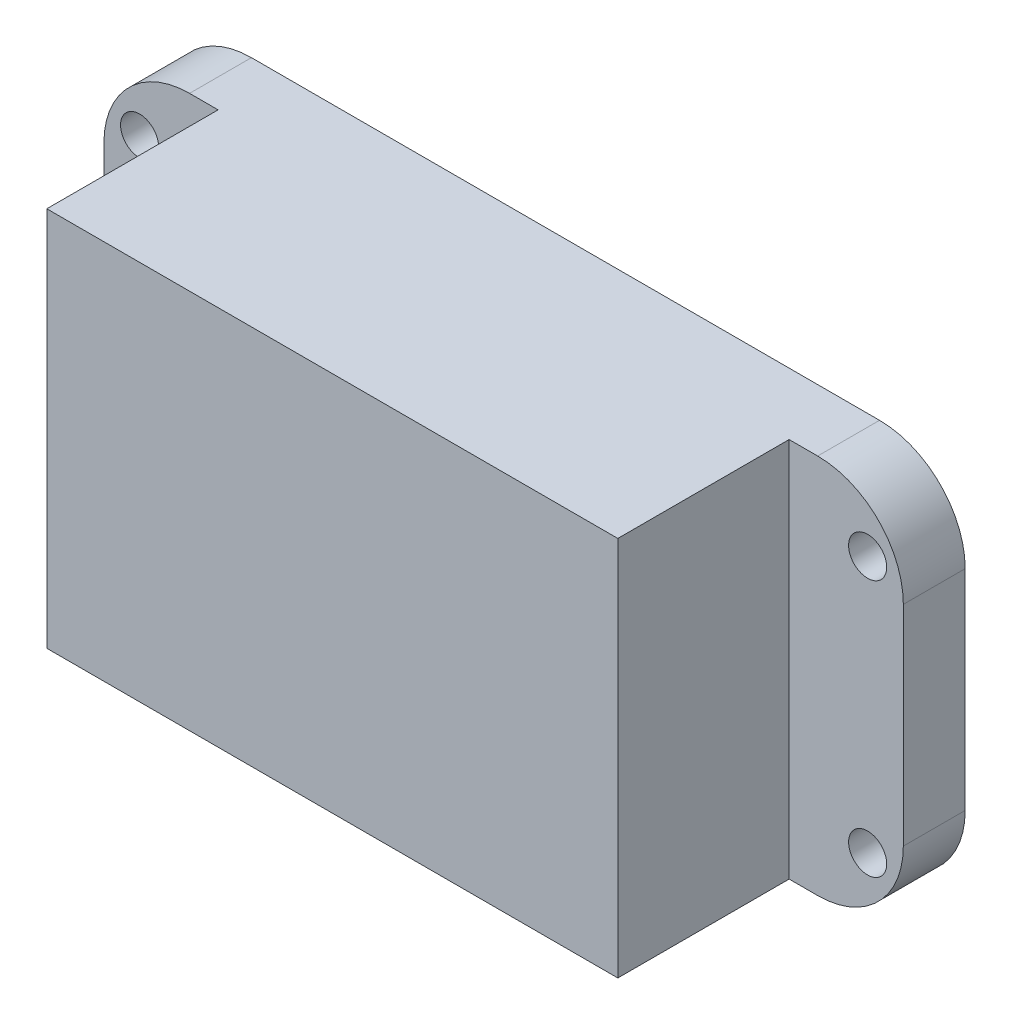
ISO-10303-21;
HEADER;
FILE_DESCRIPTION(('STEP AP214'),'2;1');
FILE_NAME('part.step','',(''),(''),'','','');
FILE_SCHEMA(('AUTOMOTIVE_DESIGN { 1 0 10303 214 1 1 1 1 }'));
ENDSEC;
DATA;
#1=APPLICATION_CONTEXT('core data for automotive mechanical design processes');
#2=APPLICATION_PROTOCOL_DEFINITION('international standard','automotive_design',2000,#1);
#3=PRODUCT_CONTEXT('',#1,'mechanical');
#4=PRODUCT('Part','Part','',(#3));
#5=PRODUCT_RELATED_PRODUCT_CATEGORY('part','',(#4));
#6=PRODUCT_DEFINITION_FORMATION('','',#4);
#7=PRODUCT_DEFINITION_CONTEXT('part definition',#1,'design');
#8=PRODUCT_DEFINITION('design','',#6,#7);
#9=PRODUCT_DEFINITION_SHAPE('','',#8);
#10=(LENGTH_UNIT() NAMED_UNIT(*) SI_UNIT(.MILLI.,.METRE.));
#11=(NAMED_UNIT(*) PLANE_ANGLE_UNIT() SI_UNIT($,.RADIAN.));
#12=(NAMED_UNIT(*) SI_UNIT($,.STERADIAN.) SOLID_ANGLE_UNIT());
#13=UNCERTAINTY_MEASURE_WITH_UNIT(LENGTH_MEASURE(1.E-05),#10,'distance_accuracy_value','');
#14=(GEOMETRIC_REPRESENTATION_CONTEXT(3) GLOBAL_UNCERTAINTY_ASSIGNED_CONTEXT((#13)) GLOBAL_UNIT_ASSIGNED_CONTEXT((#10,
#11,#12)) REPRESENTATION_CONTEXT('',''));
#15=CARTESIAN_POINT('',(0.,0.,0.));
#16=DIRECTION('',(0.,0.,1.));
#17=DIRECTION('',(1.,0.,0.));
#18=AXIS2_PLACEMENT_3D('',#15,#16,#17);
#19=CARTESIAN_POINT('',(33.,11.,6.5));
#20=DIRECTION('',(0.,0.,1.));
#21=DIRECTION('',(1.,0.,0.));
#22=AXIS2_PLACEMENT_3D('',#19,#20,#21);
#23=PLANE('',#22);
#24=DIRECTION('',(0.,-1.,0.));
#25=VECTOR('',#24,1.);
#26=CARTESIAN_POINT('',(-30.,20.,6.5));
#27=LINE('',#26,#25);
#28=CARTESIAN_POINT('',(-30.,20.,6.5));
#29=VERTEX_POINT('',#28);
#30=CARTESIAN_POINT('',(-30.,-20.,6.5));
#31=VERTEX_POINT('',#30);
#32=EDGE_CURVE('E142',#29,#31,#27,.T.);
#33=ORIENTED_EDGE('',*,*,#32,.F.);
#34=DIRECTION('',(-1.,0.,0.));
#35=VECTOR('',#34,1.);
#36=CARTESIAN_POINT('',(32.9999999999999,20.,6.5));
#37=LINE('',#36,#35);
#38=CARTESIAN_POINT('',(-32.9999999999999,20.,6.5));
#39=VERTEX_POINT('',#38);
#40=EDGE_CURVE('E176',#29,#39,#37,.T.);
#41=ORIENTED_EDGE('',*,*,#40,.T.);
#42=CARTESIAN_POINT('',(-33.,11.,6.5));
#43=DIRECTION('',(0.,0.,1.));
#44=DIRECTION('',(1.,0.,0.));
#45=AXIS2_PLACEMENT_3D('',#42,#43,#44);
#46=CIRCLE('',#45,9.);
#47=CARTESIAN_POINT('',(-42.,10.9999999999999,6.5));
#48=VERTEX_POINT('',#47);
#49=EDGE_CURVE('E180',#39,#48,#46,.T.);
#50=ORIENTED_EDGE('',*,*,#49,.T.);
#51=DIRECTION('',(0.,-1.,0.));
#52=VECTOR('',#51,1.);
#53=CARTESIAN_POINT('',(-42.,-10.9999999999999,6.5));
#54=LINE('',#53,#52);
#55=CARTESIAN_POINT('',(-42.,-11.,6.5));
#56=VERTEX_POINT('',#55);
#57=EDGE_CURVE('E182',#48,#56,#54,.T.);
#58=ORIENTED_EDGE('',*,*,#57,.T.);
#59=CARTESIAN_POINT('',(-33.,-11.,6.5));
#60=DIRECTION('',(0.,0.,1.));
#61=DIRECTION('',(-1.,0.,0.));
#62=AXIS2_PLACEMENT_3D('',#59,#60,#61);
#63=CIRCLE('',#62,9.);
#64=CARTESIAN_POINT('',(-32.9999999999999,-20.,6.5));
#65=VERTEX_POINT('',#64);
#66=EDGE_CURVE('E184',#56,#65,#63,.T.);
#67=ORIENTED_EDGE('',*,*,#66,.T.);
#68=DIRECTION('',(1.,0.,0.));
#69=VECTOR('',#68,1.);
#70=CARTESIAN_POINT('',(32.9999999999999,-20.,6.5));
#71=LINE('',#70,#69);
#72=EDGE_CURVE('E55',#65,#31,#71,.T.);
#73=ORIENTED_EDGE('',*,*,#72,.T.);
#74=EDGE_LOOP('',(#33,#41,#50,#58,#67,#73));
#75=FACE_BOUND('',#74,.T.);
#76=CARTESIAN_POINT('',(-38.25,-13.5,6.5));
#77=DIRECTION('',(0.,0.,1.));
#78=DIRECTION('',(-1.,0.,0.));
#79=AXIS2_PLACEMENT_3D('',#76,#77,#78);
#80=CIRCLE('',#79,2.);
#81=CARTESIAN_POINT('',(-40.25,-13.5,6.5));
#82=VERTEX_POINT('',#81);
#83=EDGE_CURVE('E146',#82,#82,#80,.T.);
#84=ORIENTED_EDGE('',*,*,#83,.F.);
#85=EDGE_LOOP('',(#84));
#86=FACE_BOUND('',#85,.T.);
#87=CARTESIAN_POINT('',(-38.25,13.5,6.5));
#88=DIRECTION('',(0.,0.,1.));
#89=DIRECTION('',(1.,0.,0.));
#90=AXIS2_PLACEMENT_3D('',#87,#88,#89);
#91=CIRCLE('',#90,2.);
#92=CARTESIAN_POINT('',(-40.25,13.5,6.5));
#93=VERTEX_POINT('',#92);
#94=EDGE_CURVE('E167',#93,#93,#91,.T.);
#95=ORIENTED_EDGE('',*,*,#94,.F.);
#96=EDGE_LOOP('',(#95));
#97=FACE_BOUND('',#96,.T.);
#98=ADVANCED_FACE('F32',(#75,#86,#97),#23,.T.);
#99=DIRECTION('',(0.,1.,0.));
#100=VECTOR('',#99,1.);
#101=CARTESIAN_POINT('',(30.,20.,6.5));
#102=LINE('',#101,#100);
#103=CARTESIAN_POINT('',(30.,-20.,6.5));
#104=VERTEX_POINT('',#103);
#105=CARTESIAN_POINT('',(30.,20.,6.5));
#106=VERTEX_POINT('',#105);
#107=EDGE_CURVE('E47',#104,#106,#102,.T.);
#108=ORIENTED_EDGE('',*,*,#107,.F.);
#109=CARTESIAN_POINT('',(32.9999999999999,-20.,6.5));
#110=VERTEX_POINT('',#109);
#111=EDGE_CURVE('E186',#104,#110,#71,.T.);
#112=ORIENTED_EDGE('',*,*,#111,.T.);
#113=CARTESIAN_POINT('',(33.,-11.,6.5));
#114=DIRECTION('',(0.,0.,1.));
#115=DIRECTION('',(1.,0.,0.));
#116=AXIS2_PLACEMENT_3D('',#113,#114,#115);
#117=CIRCLE('',#116,9.);
#118=CARTESIAN_POINT('',(42.,-10.9999999999999,6.5));
#119=VERTEX_POINT('',#118);
#120=EDGE_CURVE('E188',#110,#119,#117,.T.);
#121=ORIENTED_EDGE('',*,*,#120,.T.);
#122=DIRECTION('',(0.,1.,0.));
#123=VECTOR('',#122,1.);
#124=CARTESIAN_POINT('',(42.,-10.9999999999999,6.5));
#125=LINE('',#124,#123);
#126=CARTESIAN_POINT('',(42.,10.9999999999999,6.5));
#127=VERTEX_POINT('',#126);
#128=EDGE_CURVE('E190',#119,#127,#125,.T.);
#129=ORIENTED_EDGE('',*,*,#128,.T.);
#130=CARTESIAN_POINT('',(33.,11.,6.5));
#131=DIRECTION('',(0.,0.,1.));
#132=DIRECTION('',(1.,0.,0.));
#133=AXIS2_PLACEMENT_3D('',#130,#131,#132);
#134=CIRCLE('',#133,9.);
#135=CARTESIAN_POINT('',(32.9999999999999,20.,6.5));
#136=VERTEX_POINT('',#135);
#137=EDGE_CURVE('E173',#127,#136,#134,.T.);
#138=ORIENTED_EDGE('',*,*,#137,.T.);
#139=EDGE_CURVE('E178',#136,#106,#37,.T.);
#140=ORIENTED_EDGE('',*,*,#139,.T.);
#141=EDGE_LOOP('',(#108,#112,#121,#129,#138,#140));
#142=FACE_BOUND('',#141,.T.);
#143=CARTESIAN_POINT('',(38.25,-13.5,6.5));
#144=DIRECTION('',(0.,0.,1.));
#145=DIRECTION('',(1.,0.,0.));
#146=AXIS2_PLACEMENT_3D('',#143,#144,#145);
#147=CIRCLE('',#146,2.);
#148=CARTESIAN_POINT('',(36.25,-13.5,6.5));
#149=VERTEX_POINT('',#148);
#150=EDGE_CURVE('E155',#149,#149,#147,.T.);
#151=ORIENTED_EDGE('',*,*,#150,.F.);
#152=EDGE_LOOP('',(#151));
#153=FACE_BOUND('',#152,.T.);
#154=CARTESIAN_POINT('',(38.25,13.5,6.5));
#155=DIRECTION('',(0.,0.,1.));
#156=DIRECTION('',(-1.,0.,0.));
#157=AXIS2_PLACEMENT_3D('',#154,#155,#156);
#158=CIRCLE('',#157,2.);
#159=CARTESIAN_POINT('',(36.25,13.5,6.5));
#160=VERTEX_POINT('',#159);
#161=EDGE_CURVE('E161',#160,#160,#158,.T.);
#162=ORIENTED_EDGE('',*,*,#161,.F.);
#163=EDGE_LOOP('',(#162));
#164=FACE_BOUND('',#163,.T.);
#165=ADVANCED_FACE('F262',(#142,#153,#164),#23,.T.);
#166=CARTESIAN_POINT('',(33.,11.,0.));
#167=DIRECTION('',(0.,0.,1.));
#168=DIRECTION('',(1.,0.,0.));
#169=AXIS2_PLACEMENT_3D('',#166,#167,#168);
#170=PLANE('',#169);
#171=CARTESIAN_POINT('',(33.,11.,0.));
#172=DIRECTION('',(0.,0.,1.));
#173=DIRECTION('',(1.,0.,0.));
#174=AXIS2_PLACEMENT_3D('',#171,#172,#173);
#175=CIRCLE('',#174,9.);
#176=CARTESIAN_POINT('',(42.,10.9999999999999,0.));
#177=VERTEX_POINT('',#176);
#178=CARTESIAN_POINT('',(32.9999999999999,20.,0.));
#179=VERTEX_POINT('',#178);
#180=EDGE_CURVE('E170',#177,#179,#175,.T.);
#181=ORIENTED_EDGE('',*,*,#180,.F.);
#182=DIRECTION('',(0.,1.,0.));
#183=VECTOR('',#182,1.);
#184=CARTESIAN_POINT('',(42.,-10.9999999999999,0.));
#185=LINE('',#184,#183);
#186=CARTESIAN_POINT('',(42.,-10.9999999999999,0.));
#187=VERTEX_POINT('',#186);
#188=EDGE_CURVE('E177',#187,#177,#185,.T.);
#189=ORIENTED_EDGE('',*,*,#188,.F.);
#190=CARTESIAN_POINT('',(33.,-11.,0.));
#191=DIRECTION('',(0.,0.,1.));
#192=DIRECTION('',(1.,0.,0.));
#193=AXIS2_PLACEMENT_3D('',#190,#191,#192);
#194=CIRCLE('',#193,9.);
#195=CARTESIAN_POINT('',(32.9999999999999,-20.,0.));
#196=VERTEX_POINT('',#195);
#197=EDGE_CURVE('E205',#196,#187,#194,.T.);
#198=ORIENTED_EDGE('',*,*,#197,.F.);
#199=DIRECTION('',(1.,0.,0.));
#200=VECTOR('',#199,1.);
#201=CARTESIAN_POINT('',(32.9999999999999,-20.,0.));
#202=LINE('',#201,#200);
#203=CARTESIAN_POINT('',(-32.9999999999999,-20.,0.));
#204=VERTEX_POINT('',#203);
#205=EDGE_CURVE('E203',#204,#196,#202,.T.);
#206=ORIENTED_EDGE('',*,*,#205,.F.);
#207=CARTESIAN_POINT('',(-33.,-11.,0.));
#208=DIRECTION('',(0.,0.,1.));
#209=DIRECTION('',(-1.,0.,0.));
#210=AXIS2_PLACEMENT_3D('',#207,#208,#209);
#211=CIRCLE('',#210,9.);
#212=CARTESIAN_POINT('',(-42.,-11.,0.));
#213=VERTEX_POINT('',#212);
#214=EDGE_CURVE('E201',#213,#204,#211,.T.);
#215=ORIENTED_EDGE('',*,*,#214,.F.);
#216=DIRECTION('',(0.,-1.,0.));
#217=VECTOR('',#216,1.);
#218=CARTESIAN_POINT('',(-42.,-10.9999999999999,0.));
#219=LINE('',#218,#217);
#220=CARTESIAN_POINT('',(-42.,10.9999999999999,0.));
#221=VERTEX_POINT('',#220);
#222=EDGE_CURVE('E199',#221,#213,#219,.T.);
#223=ORIENTED_EDGE('',*,*,#222,.F.);
#224=CARTESIAN_POINT('',(-33.,11.,0.));
#225=DIRECTION('',(0.,0.,1.));
#226=DIRECTION('',(1.,0.,0.));
#227=AXIS2_PLACEMENT_3D('',#224,#225,#226);
#228=CIRCLE('',#227,9.);
#229=CARTESIAN_POINT('',(-32.9999999999999,20.,0.));
#230=VERTEX_POINT('',#229);
#231=EDGE_CURVE('E197',#230,#221,#228,.T.);
#232=ORIENTED_EDGE('',*,*,#231,.F.);
#233=DIRECTION('',(-1.,0.,0.));
#234=VECTOR('',#233,1.);
#235=CARTESIAN_POINT('',(32.9999999999999,20.,0.));
#236=LINE('',#235,#234);
#237=EDGE_CURVE('E195',#179,#230,#236,.T.);
#238=ORIENTED_EDGE('',*,*,#237,.F.);
#239=EDGE_LOOP('',(#181,#189,#198,#206,#215,#223,#232,#238));
#240=FACE_BOUND('',#239,.T.);
#241=CARTESIAN_POINT('',(-38.25,13.5,0.));
#242=DIRECTION('',(0.,0.,1.));
#243=DIRECTION('',(1.,0.,0.));
#244=AXIS2_PLACEMENT_3D('',#241,#242,#243);
#245=CIRCLE('',#244,2.);
#246=CARTESIAN_POINT('',(-40.25,13.5,0.));
#247=VERTEX_POINT('',#246);
#248=EDGE_CURVE('E164',#247,#247,#245,.T.);
#249=ORIENTED_EDGE('',*,*,#248,.T.);
#250=EDGE_LOOP('',(#249));
#251=FACE_BOUND('',#250,.T.);
#252=CARTESIAN_POINT('',(38.25,13.5,0.));
#253=DIRECTION('',(0.,0.,1.));
#254=DIRECTION('',(-1.,0.,0.));
#255=AXIS2_PLACEMENT_3D('',#252,#253,#254);
#256=CIRCLE('',#255,2.);
#257=CARTESIAN_POINT('',(36.25,13.5,0.));
#258=VERTEX_POINT('',#257);
#259=EDGE_CURVE('E158',#258,#258,#256,.T.);
#260=ORIENTED_EDGE('',*,*,#259,.T.);
#261=EDGE_LOOP('',(#260));
#262=FACE_BOUND('',#261,.T.);
#263=CARTESIAN_POINT('',(38.25,-13.5,0.));
#264=DIRECTION('',(0.,0.,1.));
#265=DIRECTION('',(1.,0.,0.));
#266=AXIS2_PLACEMENT_3D('',#263,#264,#265);
#267=CIRCLE('',#266,2.);
#268=CARTESIAN_POINT('',(36.25,-13.5,0.));
#269=VERTEX_POINT('',#268);
#270=EDGE_CURVE('E153',#269,#269,#267,.T.);
#271=ORIENTED_EDGE('',*,*,#270,.T.);
#272=EDGE_LOOP('',(#271));
#273=FACE_BOUND('',#272,.T.);
#274=CARTESIAN_POINT('',(-38.25,-13.5,0.));
#275=DIRECTION('',(0.,0.,1.));
#276=DIRECTION('',(-1.,0.,0.));
#277=AXIS2_PLACEMENT_3D('',#274,#275,#276);
#278=CIRCLE('',#277,2.);
#279=CARTESIAN_POINT('',(-40.25,-13.5,0.));
#280=VERTEX_POINT('',#279);
#281=EDGE_CURVE('E143',#280,#280,#278,.T.);
#282=ORIENTED_EDGE('',*,*,#281,.T.);
#283=EDGE_LOOP('',(#282));
#284=FACE_BOUND('',#283,.T.);
#285=ADVANCED_FACE('F236',(#240,#251,#262,#273,#284),#170,.F.);
#286=CARTESIAN_POINT('',(33.,11.,6.5));
#287=DIRECTION('',(0.,0.,-1.));
#288=DIRECTION('',(-1.,0.,0.));
#289=AXIS2_PLACEMENT_3D('',#286,#287,#288);
#290=CYLINDRICAL_SURFACE('',#289,9.);
#291=ORIENTED_EDGE('',*,*,#180,.T.);
#292=DIRECTION('',(0.,0.,-1.));
#293=VECTOR('',#292,1.);
#294=CARTESIAN_POINT('',(32.9999999999999,20.,6.5));
#295=LINE('',#294,#293);
#296=EDGE_CURVE('E11',#136,#179,#295,.T.);
#297=ORIENTED_EDGE('',*,*,#296,.F.);
#298=ORIENTED_EDGE('',*,*,#137,.F.);
#299=DIRECTION('',(0.,0.,-1.));
#300=VECTOR('',#299,1.);
#301=CARTESIAN_POINT('',(42.,10.9999999999999,6.5));
#302=LINE('',#301,#300);
#303=EDGE_CURVE('E192',#127,#177,#302,.T.);
#304=ORIENTED_EDGE('',*,*,#303,.T.);
#305=EDGE_LOOP('',(#291,#297,#298,#304));
#306=FACE_BOUND('',#305,.T.);
#307=ADVANCED_FACE('F34',(#306),#290,.T.);
#308=CARTESIAN_POINT('',(32.9999999999999,20.,6.5));
#309=DIRECTION('',(0.,-1.,0.));
#310=DIRECTION('',(1.,0.,0.));
#311=AXIS2_PLACEMENT_3D('',#308,#309,#310);
#312=PLANE('',#311);
#313=ORIENTED_EDGE('',*,*,#237,.T.);
#314=DIRECTION('',(0.,0.,-1.));
#315=VECTOR('',#314,1.);
#316=CARTESIAN_POINT('',(-32.9999999999999,20.,6.5));
#317=LINE('',#316,#315);
#318=EDGE_CURVE('E40',#39,#230,#317,.T.);
#319=ORIENTED_EDGE('',*,*,#318,.F.);
#320=ORIENTED_EDGE('',*,*,#40,.F.);
#321=DIRECTION('',(0.,0.,-1.));
#322=VECTOR('',#321,1.);
#323=CARTESIAN_POINT('',(-30.,20.,24.5));
#324=LINE('',#323,#322);
#325=CARTESIAN_POINT('',(-30.,20.,24.5));
#326=VERTEX_POINT('',#325);
#327=EDGE_CURVE('E250',#326,#29,#324,.T.);
#328=ORIENTED_EDGE('',*,*,#327,.F.);
#329=DIRECTION('',(-1.,0.,0.));
#330=VECTOR('',#329,1.);
#331=CARTESIAN_POINT('',(30.,20.,24.5));
#332=LINE('',#331,#330);
#333=CARTESIAN_POINT('',(30.,20.,24.5));
#334=VERTEX_POINT('',#333);
#335=EDGE_CURVE('E136',#334,#326,#332,.T.);
#336=ORIENTED_EDGE('',*,*,#335,.F.);
#337=DIRECTION('',(0.,0.,-1.));
#338=VECTOR('',#337,1.);
#339=CARTESIAN_POINT('',(30.,20.,24.5));
#340=LINE('',#339,#338);
#341=EDGE_CURVE('E148',#334,#106,#340,.T.);
#342=ORIENTED_EDGE('',*,*,#341,.T.);
#343=ORIENTED_EDGE('',*,*,#139,.F.);
#344=ORIENTED_EDGE('',*,*,#296,.T.);
#345=EDGE_LOOP('',(#313,#319,#320,#328,#336,#342,#343,#344));
#346=FACE_BOUND('',#345,.T.);
#347=ADVANCED_FACE('F249',(#346),#312,.F.);
#348=CARTESIAN_POINT('',(-33.,11.,6.5));
#349=DIRECTION('',(0.,0.,-1.));
#350=DIRECTION('',(-1.,0.,0.));
#351=AXIS2_PLACEMENT_3D('',#348,#349,#350);
#352=CYLINDRICAL_SURFACE('',#351,9.);
#353=ORIENTED_EDGE('',*,*,#231,.T.);
#354=DIRECTION('',(0.,0.,-1.));
#355=VECTOR('',#354,1.);
#356=CARTESIAN_POINT('',(-42.,10.9999999999999,6.5));
#357=LINE('',#356,#355);
#358=EDGE_CURVE('E222',#48,#221,#357,.T.);
#359=ORIENTED_EDGE('',*,*,#358,.F.);
#360=ORIENTED_EDGE('',*,*,#49,.F.);
#361=ORIENTED_EDGE('',*,*,#318,.T.);
#362=EDGE_LOOP('',(#353,#359,#360,#361));
#363=FACE_BOUND('',#362,.T.);
#364=ADVANCED_FACE('F229',(#363),#352,.T.);
#365=CARTESIAN_POINT('',(-42.,-10.9999999999999,6.5));
#366=DIRECTION('',(1.,0.,0.));
#367=DIRECTION('',(0.,0.,-1.));
#368=AXIS2_PLACEMENT_3D('',#365,#366,#367);
#369=PLANE('',#368);
#370=ORIENTED_EDGE('',*,*,#222,.T.);
#371=DIRECTION('',(0.,0.,-1.));
#372=VECTOR('',#371,1.);
#373=CARTESIAN_POINT('',(-42.,-11.,6.5));
#374=LINE('',#373,#372);
#375=EDGE_CURVE('E219',#56,#213,#374,.T.);
#376=ORIENTED_EDGE('',*,*,#375,.F.);
#377=ORIENTED_EDGE('',*,*,#57,.F.);
#378=ORIENTED_EDGE('',*,*,#358,.T.);
#379=EDGE_LOOP('',(#370,#376,#377,#378));
#380=FACE_BOUND('',#379,.T.);
#381=ADVANCED_FACE('F242',(#380),#369,.F.);
#382=CARTESIAN_POINT('',(-33.,-11.,6.5));
#383=DIRECTION('',(0.,0.,-1.));
#384=DIRECTION('',(-1.,0.,0.));
#385=AXIS2_PLACEMENT_3D('',#382,#383,#384);
#386=CYLINDRICAL_SURFACE('',#385,9.);
#387=ORIENTED_EDGE('',*,*,#214,.T.);
#388=DIRECTION('',(0.,0.,-1.));
#389=VECTOR('',#388,1.);
#390=CARTESIAN_POINT('',(-32.9999999999999,-20.,6.5));
#391=LINE('',#390,#389);
#392=EDGE_CURVE('E216',#65,#204,#391,.T.);
#393=ORIENTED_EDGE('',*,*,#392,.F.);
#394=ORIENTED_EDGE('',*,*,#66,.F.);
#395=ORIENTED_EDGE('',*,*,#375,.T.);
#396=EDGE_LOOP('',(#387,#393,#394,#395));
#397=FACE_BOUND('',#396,.T.);
#398=ADVANCED_FACE('F246',(#397),#386,.T.);
#399=CARTESIAN_POINT('',(32.9999999999999,-20.,6.5));
#400=DIRECTION('',(0.,1.,0.));
#401=DIRECTION('',(-1.,0.,0.));
#402=AXIS2_PLACEMENT_3D('',#399,#400,#401);
#403=PLANE('',#402);
#404=ORIENTED_EDGE('',*,*,#205,.T.);
#405=DIRECTION('',(0.,0.,-1.));
#406=VECTOR('',#405,1.);
#407=CARTESIAN_POINT('',(32.9999999999999,-20.,6.5));
#408=LINE('',#407,#406);
#409=EDGE_CURVE('E213',#110,#196,#408,.T.);
#410=ORIENTED_EDGE('',*,*,#409,.F.);
#411=ORIENTED_EDGE('',*,*,#111,.F.);
#412=DIRECTION('',(0.,0.,-1.));
#413=VECTOR('',#412,1.);
#414=CARTESIAN_POINT('',(30.,-20.,24.5));
#415=LINE('',#414,#413);
#416=CARTESIAN_POINT('',(30.,-20.,24.5));
#417=VERTEX_POINT('',#416);
#418=EDGE_CURVE('E127',#417,#104,#415,.T.);
#419=ORIENTED_EDGE('',*,*,#418,.F.);
#420=DIRECTION('',(1.,0.,0.));
#421=VECTOR('',#420,1.);
#422=CARTESIAN_POINT('',(30.,-20.,24.5));
#423=LINE('',#422,#421);
#424=CARTESIAN_POINT('',(-30.,-20.,24.5));
#425=VERTEX_POINT('',#424);
#426=EDGE_CURVE('E120',#425,#417,#423,.T.);
#427=ORIENTED_EDGE('',*,*,#426,.F.);
#428=DIRECTION('',(0.,0.,-1.));
#429=VECTOR('',#428,1.);
#430=CARTESIAN_POINT('',(-30.,-20.,24.5));
#431=LINE('',#430,#429);
#432=EDGE_CURVE('E124',#425,#31,#431,.T.);
#433=ORIENTED_EDGE('',*,*,#432,.T.);
#434=ORIENTED_EDGE('',*,*,#72,.F.);
#435=ORIENTED_EDGE('',*,*,#392,.T.);
#436=EDGE_LOOP('',(#404,#410,#411,#419,#427,#433,#434,#435));
#437=FACE_BOUND('',#436,.T.);
#438=ADVANCED_FACE('F122',(#437),#403,.F.);
#439=CARTESIAN_POINT('',(33.,-11.,6.5));
#440=DIRECTION('',(0.,0.,-1.));
#441=DIRECTION('',(-1.,0.,0.));
#442=AXIS2_PLACEMENT_3D('',#439,#440,#441);
#443=CYLINDRICAL_SURFACE('',#442,9.);
#444=ORIENTED_EDGE('',*,*,#197,.T.);
#445=DIRECTION('',(0.,0.,-1.));
#446=VECTOR('',#445,1.);
#447=CARTESIAN_POINT('',(42.,-10.9999999999999,6.5));
#448=LINE('',#447,#446);
#449=EDGE_CURVE('E210',#119,#187,#448,.T.);
#450=ORIENTED_EDGE('',*,*,#449,.F.);
#451=ORIENTED_EDGE('',*,*,#120,.F.);
#452=ORIENTED_EDGE('',*,*,#409,.T.);
#453=EDGE_LOOP('',(#444,#450,#451,#452));
#454=FACE_BOUND('',#453,.T.);
#455=ADVANCED_FACE('F274',(#454),#443,.T.);
#456=CARTESIAN_POINT('',(42.,-10.9999999999999,6.5));
#457=DIRECTION('',(-1.,0.,0.));
#458=DIRECTION('',(0.,0.,1.));
#459=AXIS2_PLACEMENT_3D('',#456,#457,#458);
#460=PLANE('',#459);
#461=ORIENTED_EDGE('',*,*,#188,.T.);
#462=ORIENTED_EDGE('',*,*,#303,.F.);
#463=ORIENTED_EDGE('',*,*,#128,.F.);
#464=ORIENTED_EDGE('',*,*,#449,.T.);
#465=EDGE_LOOP('',(#461,#462,#463,#464));
#466=FACE_BOUND('',#465,.T.);
#467=ADVANCED_FACE('F270',(#466),#460,.F.);
#468=CARTESIAN_POINT('',(-38.25,13.5,6.5));
#469=DIRECTION('',(0.,0.,-1.));
#470=DIRECTION('',(-1.,0.,0.));
#471=AXIS2_PLACEMENT_3D('',#468,#469,#470);
#472=CYLINDRICAL_SURFACE('',#471,2.);
#473=CARTESIAN_POINT('',(-40.25,13.5,6.5));
#474=CARTESIAN_POINT('',(-40.25,13.5,6.43229166666667));
#475=CARTESIAN_POINT('',(-40.25,13.5,6.36458333333333));
#476=CARTESIAN_POINT('',(-40.25,13.5,6.22916666666667));
#477=CARTESIAN_POINT('',(-40.25,13.5,6.16145833333333));
#478=CARTESIAN_POINT('',(-40.25,13.5,6.02604166666667));
#479=CARTESIAN_POINT('',(-40.25,13.5,5.95833333333333));
#480=CARTESIAN_POINT('',(-40.25,13.5,5.82291666666667));
#481=CARTESIAN_POINT('',(-40.25,13.5,5.75520833333333));
#482=CARTESIAN_POINT('',(-40.25,13.5,5.61979166666667));
#483=CARTESIAN_POINT('',(-40.25,13.5,5.55208333333333));
#484=CARTESIAN_POINT('',(-40.25,13.5,5.41666666666667));
#485=CARTESIAN_POINT('',(-40.25,13.5,5.34895833333333));
#486=CARTESIAN_POINT('',(-40.25,13.5,5.21354166666667));
#487=CARTESIAN_POINT('',(-40.25,13.5,5.14583333333333));
#488=CARTESIAN_POINT('',(-40.25,13.5,5.01041666666667));
#489=CARTESIAN_POINT('',(-40.25,13.5,4.94270833333333));
#490=CARTESIAN_POINT('',(-40.25,13.5,4.80729166666667));
#491=CARTESIAN_POINT('',(-40.25,13.5,4.73958333333333));
#492=CARTESIAN_POINT('',(-40.25,13.5,4.60416666666667));
#493=CARTESIAN_POINT('',(-40.25,13.5,4.53645833333333));
#494=CARTESIAN_POINT('',(-40.25,13.5,4.40104166666667));
#495=CARTESIAN_POINT('',(-40.25,13.5,4.33333333333333));
#496=CARTESIAN_POINT('',(-40.25,13.5,4.19791666666667));
#497=CARTESIAN_POINT('',(-40.25,13.5,4.13020833333333));
#498=CARTESIAN_POINT('',(-40.25,13.5,3.99479166666667));
#499=CARTESIAN_POINT('',(-40.25,13.5,3.92708333333333));
#500=CARTESIAN_POINT('',(-40.25,13.5,3.79166666666667));
#501=CARTESIAN_POINT('',(-40.25,13.5,3.72395833333333));
#502=CARTESIAN_POINT('',(-40.25,13.5,3.58854166666667));
#503=CARTESIAN_POINT('',(-40.25,13.5,3.52083333333333));
#504=CARTESIAN_POINT('',(-40.25,13.5,3.38541666666667));
#505=CARTESIAN_POINT('',(-40.25,13.5,3.31770833333333));
#506=CARTESIAN_POINT('',(-40.25,13.5,3.18229166666667));
#507=CARTESIAN_POINT('',(-40.25,13.5,3.11458333333333));
#508=CARTESIAN_POINT('',(-40.25,13.5,2.97916666666667));
#509=CARTESIAN_POINT('',(-40.25,13.5,2.91145833333333));
#510=CARTESIAN_POINT('',(-40.25,13.5,2.77604166666667));
#511=CARTESIAN_POINT('',(-40.25,13.5,2.70833333333333));
#512=CARTESIAN_POINT('',(-40.25,13.5,2.57291666666667));
#513=CARTESIAN_POINT('',(-40.25,13.5,2.50520833333333));
#514=CARTESIAN_POINT('',(-40.25,13.5,2.36979166666667));
#515=CARTESIAN_POINT('',(-40.25,13.5,2.30208333333333));
#516=CARTESIAN_POINT('',(-40.25,13.5,2.16666666666667));
#517=CARTESIAN_POINT('',(-40.25,13.5,2.09895833333333));
#518=CARTESIAN_POINT('',(-40.25,13.5,1.96354166666667));
#519=CARTESIAN_POINT('',(-40.25,13.5,1.89583333333333));
#520=CARTESIAN_POINT('',(-40.25,13.5,1.76041666666667));
#521=CARTESIAN_POINT('',(-40.25,13.5,1.69270833333333));
#522=CARTESIAN_POINT('',(-40.25,13.5,1.55729166666667));
#523=CARTESIAN_POINT('',(-40.25,13.5,1.48958333333333));
#524=CARTESIAN_POINT('',(-40.25,13.5,1.35416666666667));
#525=CARTESIAN_POINT('',(-40.25,13.5,1.28645833333333));
#526=CARTESIAN_POINT('',(-40.25,13.5,1.15104166666667));
#527=CARTESIAN_POINT('',(-40.25,13.5,1.08333333333333));
#528=CARTESIAN_POINT('',(-40.25,13.5,0.947916666666667));
#529=CARTESIAN_POINT('',(-40.25,13.5,0.880208333333333));
#530=CARTESIAN_POINT('',(-40.25,13.5,0.744791666666667));
#531=CARTESIAN_POINT('',(-40.25,13.5,0.677083333333333));
#532=CARTESIAN_POINT('',(-40.25,13.5,0.541666666666667));
#533=CARTESIAN_POINT('',(-40.25,13.5,0.473958333333333));
#534=CARTESIAN_POINT('',(-40.25,13.5,0.338541666666667));
#535=CARTESIAN_POINT('',(-40.25,13.5,0.270833333333334));
#536=CARTESIAN_POINT('',(-40.25,13.5,0.135416666666667));
#537=CARTESIAN_POINT('',(-40.25,13.5,0.0677083333333334));
#538=CARTESIAN_POINT('',(-40.25,13.5,0.));
#539=B_SPLINE_CURVE_WITH_KNOTS('',3,(#473,#474,#475,#476,#477,#478,#479,#480,#481,#482,#483,
#484,#485,#486,#487,#488,#489,#490,#491,#492,#493,#494,#495,#496,#497,#498,#499,#500,#501,#502,
#503,#504,#505,#506,#507,#508,#509,#510,#511,#512,#513,#514,#515,#516,#517,#518,#519,#520,#521,
#522,#523,#524,#525,#526,#527,#528,#529,#530,#531,#532,#533,#534,#535,#536,#537,#538),
.UNSPECIFIED.,.F.,.F.,(4,2,2,2,2,2,2,2,2,2,2,2,2,2,2,2,2,2,2,2,2,2,2,2,2,2,2,2,2,2,2,2,4),(0.,
0.203124999999999,0.40625,0.609375,0.812499999999999,1.015625,1.21875,1.421875,1.625,1.828125,
2.03125,2.234375,2.4375,2.640625,2.84375,3.046875,3.25,3.453125,3.65625,3.859375,4.0625,
4.265625,4.46875,4.671875,4.875,5.078125,5.28125,5.484375,5.6875,5.890625,6.09375,6.296875,6.5),.UNSPECIFIED.);
#540=EDGE_CURVE('BSEAM282',#93,#247,#539,.T.);
#541=ORIENTED_EDGE('',*,*,#94,.T.);
#542=ORIENTED_EDGE('',*,*,#248,.F.);
#543=ORIENTED_EDGE('',*,*,#540,.T.);
#544=ORIENTED_EDGE('',*,*,#540,.F.);
#545=EDGE_LOOP('',(#541,#543,#542,#544));
#546=FACE_BOUND('',#545,.T.);
#547=ADVANCED_FACE('F282',(#546),#472,.F.);
#548=CARTESIAN_POINT('',(38.25,13.5,6.5));
#549=DIRECTION('',(0.,0.,-1.));
#550=DIRECTION('',(-1.,0.,0.));
#551=AXIS2_PLACEMENT_3D('',#548,#549,#550);
#552=CYLINDRICAL_SURFACE('',#551,2.);
#553=CARTESIAN_POINT('',(36.25,13.5,6.5));
#554=CARTESIAN_POINT('',(36.25,13.5,6.43229166666667));
#555=CARTESIAN_POINT('',(36.25,13.5,6.36458333333333));
#556=CARTESIAN_POINT('',(36.25,13.5,6.22916666666667));
#557=CARTESIAN_POINT('',(36.25,13.5,6.16145833333333));
#558=CARTESIAN_POINT('',(36.25,13.5,6.02604166666667));
#559=CARTESIAN_POINT('',(36.25,13.5,5.95833333333333));
#560=CARTESIAN_POINT('',(36.25,13.5,5.82291666666667));
#561=CARTESIAN_POINT('',(36.25,13.5,5.75520833333333));
#562=CARTESIAN_POINT('',(36.25,13.5,5.61979166666667));
#563=CARTESIAN_POINT('',(36.25,13.5,5.55208333333333));
#564=CARTESIAN_POINT('',(36.25,13.5,5.41666666666667));
#565=CARTESIAN_POINT('',(36.25,13.5,5.34895833333333));
#566=CARTESIAN_POINT('',(36.25,13.5,5.21354166666667));
#567=CARTESIAN_POINT('',(36.25,13.5,5.14583333333333));
#568=CARTESIAN_POINT('',(36.25,13.5,5.01041666666667));
#569=CARTESIAN_POINT('',(36.25,13.5,4.94270833333333));
#570=CARTESIAN_POINT('',(36.25,13.5,4.80729166666667));
#571=CARTESIAN_POINT('',(36.25,13.5,4.73958333333333));
#572=CARTESIAN_POINT('',(36.25,13.5,4.60416666666667));
#573=CARTESIAN_POINT('',(36.25,13.5,4.53645833333333));
#574=CARTESIAN_POINT('',(36.25,13.5,4.40104166666667));
#575=CARTESIAN_POINT('',(36.25,13.5,4.33333333333333));
#576=CARTESIAN_POINT('',(36.25,13.5,4.19791666666667));
#577=CARTESIAN_POINT('',(36.25,13.5,4.13020833333333));
#578=CARTESIAN_POINT('',(36.25,13.5,3.99479166666667));
#579=CARTESIAN_POINT('',(36.25,13.5,3.92708333333333));
#580=CARTESIAN_POINT('',(36.25,13.5,3.79166666666667));
#581=CARTESIAN_POINT('',(36.25,13.5,3.72395833333333));
#582=CARTESIAN_POINT('',(36.25,13.5,3.58854166666667));
#583=CARTESIAN_POINT('',(36.25,13.5,3.52083333333333));
#584=CARTESIAN_POINT('',(36.25,13.5,3.38541666666667));
#585=CARTESIAN_POINT('',(36.25,13.5,3.31770833333333));
#586=CARTESIAN_POINT('',(36.25,13.5,3.18229166666667));
#587=CARTESIAN_POINT('',(36.25,13.5,3.11458333333333));
#588=CARTESIAN_POINT('',(36.25,13.5,2.97916666666667));
#589=CARTESIAN_POINT('',(36.25,13.5,2.91145833333333));
#590=CARTESIAN_POINT('',(36.25,13.5,2.77604166666667));
#591=CARTESIAN_POINT('',(36.25,13.5,2.70833333333333));
#592=CARTESIAN_POINT('',(36.25,13.5,2.57291666666667));
#593=CARTESIAN_POINT('',(36.25,13.5,2.50520833333333));
#594=CARTESIAN_POINT('',(36.25,13.5,2.36979166666667));
#595=CARTESIAN_POINT('',(36.25,13.5,2.30208333333333));
#596=CARTESIAN_POINT('',(36.25,13.5,2.16666666666667));
#597=CARTESIAN_POINT('',(36.25,13.5,2.09895833333333));
#598=CARTESIAN_POINT('',(36.25,13.5,1.96354166666667));
#599=CARTESIAN_POINT('',(36.25,13.5,1.89583333333333));
#600=CARTESIAN_POINT('',(36.25,13.5,1.76041666666667));
#601=CARTESIAN_POINT('',(36.25,13.5,1.69270833333333));
#602=CARTESIAN_POINT('',(36.25,13.5,1.55729166666667));
#603=CARTESIAN_POINT('',(36.25,13.5,1.48958333333333));
#604=CARTESIAN_POINT('',(36.25,13.5,1.35416666666667));
#605=CARTESIAN_POINT('',(36.25,13.5,1.28645833333333));
#606=CARTESIAN_POINT('',(36.25,13.5,1.15104166666667));
#607=CARTESIAN_POINT('',(36.25,13.5,1.08333333333333));
#608=CARTESIAN_POINT('',(36.25,13.5,0.947916666666667));
#609=CARTESIAN_POINT('',(36.25,13.5,0.880208333333333));
#610=CARTESIAN_POINT('',(36.25,13.5,0.744791666666667));
#611=CARTESIAN_POINT('',(36.25,13.5,0.677083333333333));
#612=CARTESIAN_POINT('',(36.25,13.5,0.541666666666667));
#613=CARTESIAN_POINT('',(36.25,13.5,0.473958333333333));
#614=CARTESIAN_POINT('',(36.25,13.5,0.338541666666667));
#615=CARTESIAN_POINT('',(36.25,13.5,0.270833333333334));
#616=CARTESIAN_POINT('',(36.25,13.5,0.135416666666667));
#617=CARTESIAN_POINT('',(36.25,13.5,0.0677083333333334));
#618=CARTESIAN_POINT('',(36.25,13.5,0.));
#619=B_SPLINE_CURVE_WITH_KNOTS('',3,(#553,#554,#555,#556,#557,#558,#559,#560,#561,#562,#563,
#564,#565,#566,#567,#568,#569,#570,#571,#572,#573,#574,#575,#576,#577,#578,#579,#580,#581,#582,
#583,#584,#585,#586,#587,#588,#589,#590,#591,#592,#593,#594,#595,#596,#597,#598,#599,#600,#601,
#602,#603,#604,#605,#606,#607,#608,#609,#610,#611,#612,#613,#614,#615,#616,#617,#618),
.UNSPECIFIED.,.F.,.F.,(4,2,2,2,2,2,2,2,2,2,2,2,2,2,2,2,2,2,2,2,2,2,2,2,2,2,2,2,2,2,2,2,4),(0.,
0.203124999999999,0.40625,0.609375,0.812499999999999,1.015625,1.21875,1.421875,1.625,1.828125,
2.03125,2.234375,2.4375,2.640625,2.84375,3.046875,3.25,3.453125,3.65625,3.859375,4.0625,
4.265625,4.46875,4.671875,4.875,5.078125,5.28125,5.484375,5.6875,5.890625,6.09375,6.296875,6.5),.UNSPECIFIED.);
#620=EDGE_CURVE('BSEAM355',#160,#258,#619,.T.);
#621=ORIENTED_EDGE('',*,*,#161,.T.);
#622=ORIENTED_EDGE('',*,*,#259,.F.);
#623=ORIENTED_EDGE('',*,*,#620,.T.);
#624=ORIENTED_EDGE('',*,*,#620,.F.);
#625=EDGE_LOOP('',(#621,#623,#622,#624));
#626=FACE_BOUND('',#625,.T.);
#627=ADVANCED_FACE('F355',(#626),#552,.F.);
#628=CARTESIAN_POINT('',(38.25,-13.5,6.5));
#629=DIRECTION('',(0.,0.,-1.));
#630=DIRECTION('',(-1.,0.,0.));
#631=AXIS2_PLACEMENT_3D('',#628,#629,#630);
#632=CYLINDRICAL_SURFACE('',#631,2.);
#633=CARTESIAN_POINT('',(36.25,-13.5,6.5));
#634=CARTESIAN_POINT('',(36.25,-13.5,6.43229166666667));
#635=CARTESIAN_POINT('',(36.25,-13.5,6.36458333333333));
#636=CARTESIAN_POINT('',(36.25,-13.5,6.22916666666667));
#637=CARTESIAN_POINT('',(36.25,-13.5,6.16145833333333));
#638=CARTESIAN_POINT('',(36.25,-13.5,6.02604166666667));
#639=CARTESIAN_POINT('',(36.25,-13.5,5.95833333333333));
#640=CARTESIAN_POINT('',(36.25,-13.5,5.82291666666667));
#641=CARTESIAN_POINT('',(36.25,-13.5,5.75520833333333));
#642=CARTESIAN_POINT('',(36.25,-13.5,5.61979166666667));
#643=CARTESIAN_POINT('',(36.25,-13.5,5.55208333333333));
#644=CARTESIAN_POINT('',(36.25,-13.5,5.41666666666667));
#645=CARTESIAN_POINT('',(36.25,-13.5,5.34895833333333));
#646=CARTESIAN_POINT('',(36.25,-13.5,5.21354166666667));
#647=CARTESIAN_POINT('',(36.25,-13.5,5.14583333333333));
#648=CARTESIAN_POINT('',(36.25,-13.5,5.01041666666667));
#649=CARTESIAN_POINT('',(36.25,-13.5,4.94270833333333));
#650=CARTESIAN_POINT('',(36.25,-13.5,4.80729166666667));
#651=CARTESIAN_POINT('',(36.25,-13.5,4.73958333333333));
#652=CARTESIAN_POINT('',(36.25,-13.5,4.60416666666667));
#653=CARTESIAN_POINT('',(36.25,-13.5,4.53645833333333));
#654=CARTESIAN_POINT('',(36.25,-13.5,4.40104166666667));
#655=CARTESIAN_POINT('',(36.25,-13.5,4.33333333333333));
#656=CARTESIAN_POINT('',(36.25,-13.5,4.19791666666667));
#657=CARTESIAN_POINT('',(36.25,-13.5,4.13020833333333));
#658=CARTESIAN_POINT('',(36.25,-13.5,3.99479166666667));
#659=CARTESIAN_POINT('',(36.25,-13.5,3.92708333333333));
#660=CARTESIAN_POINT('',(36.25,-13.5,3.79166666666667));
#661=CARTESIAN_POINT('',(36.25,-13.5,3.72395833333333));
#662=CARTESIAN_POINT('',(36.25,-13.5,3.58854166666667));
#663=CARTESIAN_POINT('',(36.25,-13.5,3.52083333333333));
#664=CARTESIAN_POINT('',(36.25,-13.5,3.38541666666667));
#665=CARTESIAN_POINT('',(36.25,-13.5,3.31770833333333));
#666=CARTESIAN_POINT('',(36.25,-13.5,3.18229166666667));
#667=CARTESIAN_POINT('',(36.25,-13.5,3.11458333333333));
#668=CARTESIAN_POINT('',(36.25,-13.5,2.97916666666667));
#669=CARTESIAN_POINT('',(36.25,-13.5,2.91145833333333));
#670=CARTESIAN_POINT('',(36.25,-13.5,2.77604166666667));
#671=CARTESIAN_POINT('',(36.25,-13.5,2.70833333333333));
#672=CARTESIAN_POINT('',(36.25,-13.5,2.57291666666667));
#673=CARTESIAN_POINT('',(36.25,-13.5,2.50520833333333));
#674=CARTESIAN_POINT('',(36.25,-13.5,2.36979166666667));
#675=CARTESIAN_POINT('',(36.25,-13.5,2.30208333333333));
#676=CARTESIAN_POINT('',(36.25,-13.5,2.16666666666667));
#677=CARTESIAN_POINT('',(36.25,-13.5,2.09895833333333));
#678=CARTESIAN_POINT('',(36.25,-13.5,1.96354166666667));
#679=CARTESIAN_POINT('',(36.25,-13.5,1.89583333333333));
#680=CARTESIAN_POINT('',(36.25,-13.5,1.76041666666667));
#681=CARTESIAN_POINT('',(36.25,-13.5,1.69270833333333));
#682=CARTESIAN_POINT('',(36.25,-13.5,1.55729166666667));
#683=CARTESIAN_POINT('',(36.25,-13.5,1.48958333333333));
#684=CARTESIAN_POINT('',(36.25,-13.5,1.35416666666667));
#685=CARTESIAN_POINT('',(36.25,-13.5,1.28645833333333));
#686=CARTESIAN_POINT('',(36.25,-13.5,1.15104166666667));
#687=CARTESIAN_POINT('',(36.25,-13.5,1.08333333333333));
#688=CARTESIAN_POINT('',(36.25,-13.5,0.947916666666667));
#689=CARTESIAN_POINT('',(36.25,-13.5,0.880208333333333));
#690=CARTESIAN_POINT('',(36.25,-13.5,0.744791666666667));
#691=CARTESIAN_POINT('',(36.25,-13.5,0.677083333333333));
#692=CARTESIAN_POINT('',(36.25,-13.5,0.541666666666667));
#693=CARTESIAN_POINT('',(36.25,-13.5,0.473958333333333));
#694=CARTESIAN_POINT('',(36.25,-13.5,0.338541666666667));
#695=CARTESIAN_POINT('',(36.25,-13.5,0.270833333333334));
#696=CARTESIAN_POINT('',(36.25,-13.5,0.135416666666667));
#697=CARTESIAN_POINT('',(36.25,-13.5,0.0677083333333334));
#698=CARTESIAN_POINT('',(36.25,-13.5,0.));
#699=B_SPLINE_CURVE_WITH_KNOTS('',3,(#633,#634,#635,#636,#637,#638,#639,#640,#641,#642,#643,
#644,#645,#646,#647,#648,#649,#650,#651,#652,#653,#654,#655,#656,#657,#658,#659,#660,#661,#662,
#663,#664,#665,#666,#667,#668,#669,#670,#671,#672,#673,#674,#675,#676,#677,#678,#679,#680,#681,
#682,#683,#684,#685,#686,#687,#688,#689,#690,#691,#692,#693,#694,#695,#696,#697,#698),
.UNSPECIFIED.,.F.,.F.,(4,2,2,2,2,2,2,2,2,2,2,2,2,2,2,2,2,2,2,2,2,2,2,2,2,2,2,2,2,2,2,2,4),(0.,
0.203124999999999,0.40625,0.609375,0.812499999999999,1.015625,1.21875,1.421875,1.625,1.828125,
2.03125,2.234375,2.4375,2.640625,2.84375,3.046875,3.25,3.453125,3.65625,3.859375,4.0625,
4.265625,4.46875,4.671875,4.875,5.078125,5.28125,5.484375,5.6875,5.890625,6.09375,6.296875,6.5),.UNSPECIFIED.);
#700=EDGE_CURVE('BSEAM352',#149,#269,#699,.T.);
#701=ORIENTED_EDGE('',*,*,#150,.T.);
#702=ORIENTED_EDGE('',*,*,#270,.F.);
#703=ORIENTED_EDGE('',*,*,#700,.T.);
#704=ORIENTED_EDGE('',*,*,#700,.F.);
#705=EDGE_LOOP('',(#701,#703,#702,#704));
#706=FACE_BOUND('',#705,.T.);
#707=ADVANCED_FACE('F352',(#706),#632,.F.);
#708=CARTESIAN_POINT('',(-38.25,-13.5,6.5));
#709=DIRECTION('',(0.,0.,-1.));
#710=DIRECTION('',(-1.,0.,0.));
#711=AXIS2_PLACEMENT_3D('',#708,#709,#710);
#712=CYLINDRICAL_SURFACE('',#711,2.);
#713=CARTESIAN_POINT('',(-40.25,-13.5,6.5));
#714=CARTESIAN_POINT('',(-40.25,-13.5,6.43229166666667));
#715=CARTESIAN_POINT('',(-40.25,-13.5,6.36458333333333));
#716=CARTESIAN_POINT('',(-40.25,-13.5,6.22916666666667));
#717=CARTESIAN_POINT('',(-40.25,-13.5,6.16145833333333));
#718=CARTESIAN_POINT('',(-40.25,-13.5,6.02604166666667));
#719=CARTESIAN_POINT('',(-40.25,-13.5,5.95833333333333));
#720=CARTESIAN_POINT('',(-40.25,-13.5,5.82291666666667));
#721=CARTESIAN_POINT('',(-40.25,-13.5,5.75520833333333));
#722=CARTESIAN_POINT('',(-40.25,-13.5,5.61979166666667));
#723=CARTESIAN_POINT('',(-40.25,-13.5,5.55208333333333));
#724=CARTESIAN_POINT('',(-40.25,-13.5,5.41666666666667));
#725=CARTESIAN_POINT('',(-40.25,-13.5,5.34895833333333));
#726=CARTESIAN_POINT('',(-40.25,-13.5,5.21354166666667));
#727=CARTESIAN_POINT('',(-40.25,-13.5,5.14583333333333));
#728=CARTESIAN_POINT('',(-40.25,-13.5,5.01041666666667));
#729=CARTESIAN_POINT('',(-40.25,-13.5,4.94270833333333));
#730=CARTESIAN_POINT('',(-40.25,-13.5,4.80729166666667));
#731=CARTESIAN_POINT('',(-40.25,-13.5,4.73958333333333));
#732=CARTESIAN_POINT('',(-40.25,-13.5,4.60416666666667));
#733=CARTESIAN_POINT('',(-40.25,-13.5,4.53645833333333));
#734=CARTESIAN_POINT('',(-40.25,-13.5,4.40104166666667));
#735=CARTESIAN_POINT('',(-40.25,-13.5,4.33333333333333));
#736=CARTESIAN_POINT('',(-40.25,-13.5,4.19791666666667));
#737=CARTESIAN_POINT('',(-40.25,-13.5,4.13020833333333));
#738=CARTESIAN_POINT('',(-40.25,-13.5,3.99479166666667));
#739=CARTESIAN_POINT('',(-40.25,-13.5,3.92708333333333));
#740=CARTESIAN_POINT('',(-40.25,-13.5,3.79166666666667));
#741=CARTESIAN_POINT('',(-40.25,-13.5,3.72395833333333));
#742=CARTESIAN_POINT('',(-40.25,-13.5,3.58854166666667));
#743=CARTESIAN_POINT('',(-40.25,-13.5,3.52083333333333));
#744=CARTESIAN_POINT('',(-40.25,-13.5,3.38541666666667));
#745=CARTESIAN_POINT('',(-40.25,-13.5,3.31770833333333));
#746=CARTESIAN_POINT('',(-40.25,-13.5,3.18229166666667));
#747=CARTESIAN_POINT('',(-40.25,-13.5,3.11458333333333));
#748=CARTESIAN_POINT('',(-40.25,-13.5,2.97916666666667));
#749=CARTESIAN_POINT('',(-40.25,-13.5,2.91145833333333));
#750=CARTESIAN_POINT('',(-40.25,-13.5,2.77604166666667));
#751=CARTESIAN_POINT('',(-40.25,-13.5,2.70833333333333));
#752=CARTESIAN_POINT('',(-40.25,-13.5,2.57291666666667));
#753=CARTESIAN_POINT('',(-40.25,-13.5,2.50520833333333));
#754=CARTESIAN_POINT('',(-40.25,-13.5,2.36979166666667));
#755=CARTESIAN_POINT('',(-40.25,-13.5,2.30208333333333));
#756=CARTESIAN_POINT('',(-40.25,-13.5,2.16666666666667));
#757=CARTESIAN_POINT('',(-40.25,-13.5,2.09895833333333));
#758=CARTESIAN_POINT('',(-40.25,-13.5,1.96354166666667));
#759=CARTESIAN_POINT('',(-40.25,-13.5,1.89583333333333));
#760=CARTESIAN_POINT('',(-40.25,-13.5,1.76041666666667));
#761=CARTESIAN_POINT('',(-40.25,-13.5,1.69270833333333));
#762=CARTESIAN_POINT('',(-40.25,-13.5,1.55729166666667));
#763=CARTESIAN_POINT('',(-40.25,-13.5,1.48958333333333));
#764=CARTESIAN_POINT('',(-40.25,-13.5,1.35416666666667));
#765=CARTESIAN_POINT('',(-40.25,-13.5,1.28645833333333));
#766=CARTESIAN_POINT('',(-40.25,-13.5,1.15104166666667));
#767=CARTESIAN_POINT('',(-40.25,-13.5,1.08333333333333));
#768=CARTESIAN_POINT('',(-40.25,-13.5,0.947916666666667));
#769=CARTESIAN_POINT('',(-40.25,-13.5,0.880208333333333));
#770=CARTESIAN_POINT('',(-40.25,-13.5,0.744791666666667));
#771=CARTESIAN_POINT('',(-40.25,-13.5,0.677083333333333));
#772=CARTESIAN_POINT('',(-40.25,-13.5,0.541666666666667));
#773=CARTESIAN_POINT('',(-40.25,-13.5,0.473958333333333));
#774=CARTESIAN_POINT('',(-40.25,-13.5,0.338541666666667));
#775=CARTESIAN_POINT('',(-40.25,-13.5,0.270833333333334));
#776=CARTESIAN_POINT('',(-40.25,-13.5,0.135416666666667));
#777=CARTESIAN_POINT('',(-40.25,-13.5,0.0677083333333334));
#778=CARTESIAN_POINT('',(-40.25,-13.5,0.));
#779=B_SPLINE_CURVE_WITH_KNOTS('',3,(#713,#714,#715,#716,#717,#718,#719,#720,#721,#722,#723,
#724,#725,#726,#727,#728,#729,#730,#731,#732,#733,#734,#735,#736,#737,#738,#739,#740,#741,#742,
#743,#744,#745,#746,#747,#748,#749,#750,#751,#752,#753,#754,#755,#756,#757,#758,#759,#760,#761,
#762,#763,#764,#765,#766,#767,#768,#769,#770,#771,#772,#773,#774,#775,#776,#777,#778),
.UNSPECIFIED.,.F.,.F.,(4,2,2,2,2,2,2,2,2,2,2,2,2,2,2,2,2,2,2,2,2,2,2,2,2,2,2,2,2,2,2,2,4),(0.,
0.203124999999999,0.40625,0.609375,0.812499999999999,1.015625,1.21875,1.421875,1.625,1.828125,
2.03125,2.234375,2.4375,2.640625,2.84375,3.046875,3.25,3.453125,3.65625,3.859375,4.0625,
4.265625,4.46875,4.671875,4.875,5.078125,5.28125,5.484375,5.6875,5.890625,6.09375,6.296875,6.5),.UNSPECIFIED.);
#780=EDGE_CURVE('BSEAM329',#82,#280,#779,.T.);
#781=ORIENTED_EDGE('',*,*,#83,.T.);
#782=ORIENTED_EDGE('',*,*,#281,.F.);
#783=ORIENTED_EDGE('',*,*,#780,.T.);
#784=ORIENTED_EDGE('',*,*,#780,.F.);
#785=EDGE_LOOP('',(#781,#783,#782,#784));
#786=FACE_BOUND('',#785,.T.);
#787=ADVANCED_FACE('F329',(#786),#712,.F.);
#788=CARTESIAN_POINT('',(-30.,20.,24.5));
#789=DIRECTION('',(1.,0.,0.));
#790=DIRECTION('',(0.,0.,-1.));
#791=AXIS2_PLACEMENT_3D('',#788,#789,#790);
#792=PLANE('',#791);
#793=ORIENTED_EDGE('',*,*,#32,.T.);
#794=ORIENTED_EDGE('',*,*,#432,.F.);
#795=DIRECTION('',(0.,-1.,0.));
#796=VECTOR('',#795,1.);
#797=CARTESIAN_POINT('',(-30.,20.,24.5));
#798=LINE('',#797,#796);
#799=EDGE_CURVE('E131',#326,#425,#798,.T.);
#800=ORIENTED_EDGE('',*,*,#799,.F.);
#801=ORIENTED_EDGE('',*,*,#327,.T.);
#802=EDGE_LOOP('',(#793,#794,#800,#801));
#803=FACE_BOUND('',#802,.T.);
#804=ADVANCED_FACE('F141',(#803),#792,.F.);
#805=CARTESIAN_POINT('',(30.,20.,24.5));
#806=DIRECTION('',(-1.,0.,0.));
#807=DIRECTION('',(0.,0.,1.));
#808=AXIS2_PLACEMENT_3D('',#805,#806,#807);
#809=PLANE('',#808);
#810=ORIENTED_EDGE('',*,*,#107,.T.);
#811=ORIENTED_EDGE('',*,*,#341,.F.);
#812=DIRECTION('',(0.,1.,0.));
#813=VECTOR('',#812,1.);
#814=CARTESIAN_POINT('',(30.,20.,24.5));
#815=LINE('',#814,#813);
#816=EDGE_CURVE('E130',#417,#334,#815,.T.);
#817=ORIENTED_EDGE('',*,*,#816,.F.);
#818=ORIENTED_EDGE('',*,*,#418,.T.);
#819=EDGE_LOOP('',(#810,#811,#817,#818));
#820=FACE_BOUND('',#819,.T.);
#821=ADVANCED_FACE('F259',(#820),#809,.F.);
#822=CARTESIAN_POINT('',(0.,0.,24.5));
#823=DIRECTION('',(0.,0.,-1.));
#824=DIRECTION('',(-1.,0.,0.));
#825=AXIS2_PLACEMENT_3D('',#822,#823,#824);
#826=PLANE('',#825);
#827=ORIENTED_EDGE('',*,*,#799,.T.);
#828=ORIENTED_EDGE('',*,*,#426,.T.);
#829=ORIENTED_EDGE('',*,*,#816,.T.);
#830=ORIENTED_EDGE('',*,*,#335,.T.);
#831=EDGE_LOOP('',(#827,#828,#829,#830));
#832=FACE_BOUND('',#831,.T.);
#833=ADVANCED_FACE('F134',(#832),#826,.F.);
#834=CLOSED_SHELL('',(#98,#165,#285,#307,#347,#364,#381,#398,#438,#455,#467,#547,#627,#707,#787,
#804,#821,#833));
#835=MANIFOLD_SOLID_BREP('B2',#834);
#836=ADVANCED_BREP_SHAPE_REPRESENTATION('',(#18,#835),#14);
#837=SHAPE_DEFINITION_REPRESENTATION(#9,#836);
ENDSEC;
END-ISO-10303-21;
